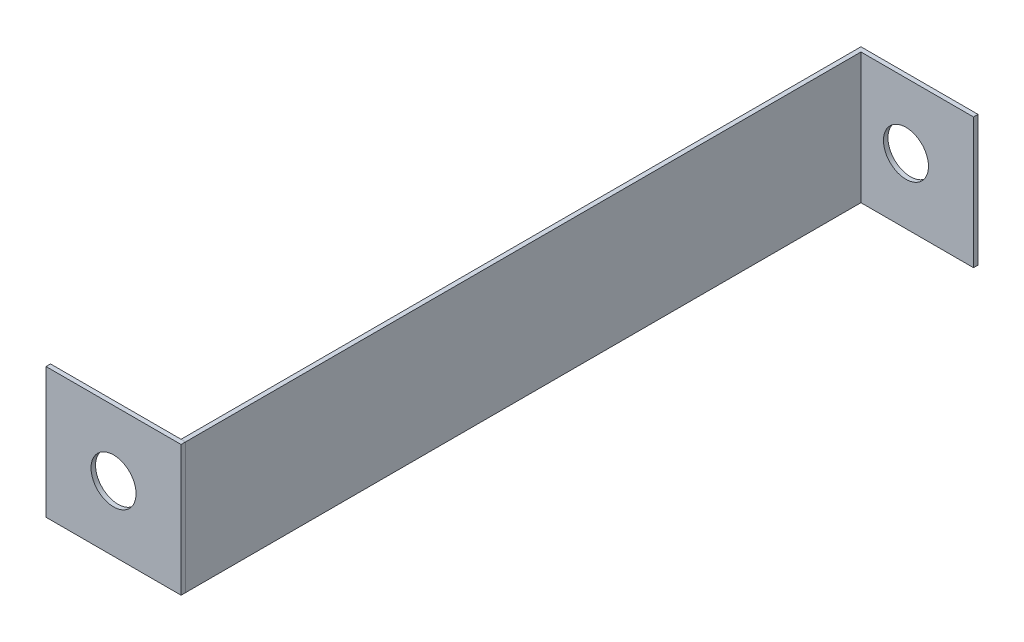
ISO-10303-21;
HEADER;
FILE_DESCRIPTION(('STEP AP214'),'2;1');
FILE_NAME('part.step','',(''),(''),'','','');
FILE_SCHEMA(('AUTOMOTIVE_DESIGN { 1 0 10303 214 1 1 1 1 }'));
ENDSEC;
DATA;
#1=APPLICATION_CONTEXT('core data for automotive mechanical design processes');
#2=APPLICATION_PROTOCOL_DEFINITION('international standard','automotive_design',2000,#1);
#3=PRODUCT_CONTEXT('',#1,'mechanical');
#4=PRODUCT('Part','Part','',(#3));
#5=PRODUCT_RELATED_PRODUCT_CATEGORY('part','',(#4));
#6=PRODUCT_DEFINITION_FORMATION('','',#4);
#7=PRODUCT_DEFINITION_CONTEXT('part definition',#1,'design');
#8=PRODUCT_DEFINITION('design','',#6,#7);
#9=PRODUCT_DEFINITION_SHAPE('','',#8);
#10=(LENGTH_UNIT() NAMED_UNIT(*) SI_UNIT(.MILLI.,.METRE.));
#11=(NAMED_UNIT(*) PLANE_ANGLE_UNIT() SI_UNIT($,.RADIAN.));
#12=(NAMED_UNIT(*) SI_UNIT($,.STERADIAN.) SOLID_ANGLE_UNIT());
#13=UNCERTAINTY_MEASURE_WITH_UNIT(LENGTH_MEASURE(1.E-05),#10,'distance_accuracy_value','');
#14=(GEOMETRIC_REPRESENTATION_CONTEXT(3) GLOBAL_UNCERTAINTY_ASSIGNED_CONTEXT((#13)) GLOBAL_UNIT_ASSIGNED_CONTEXT((#10,
#11,#12)) REPRESENTATION_CONTEXT('',''));
#15=CARTESIAN_POINT('',(0.,0.,0.));
#16=DIRECTION('',(0.,0.,1.));
#17=DIRECTION('',(1.,0.,0.));
#18=AXIS2_PLACEMENT_3D('',#15,#16,#17);
#19=CARTESIAN_POINT('',(0.,29.,152.));
#20=DIRECTION('',(0.,-1.,0.));
#21=DIRECTION('',(0.,0.,-1.));
#22=AXIS2_PLACEMENT_3D('',#19,#20,#21);
#23=PLANE('',#22);
#24=DIRECTION('',(-1.,0.,0.));
#25=VECTOR('',#24,1.);
#26=CARTESIAN_POINT('',(0.,29.,151.));
#27=LINE('',#26,#25);
#28=CARTESIAN_POINT('',(-25.,29.,151.));
#29=VERTEX_POINT('',#28);
#30=CARTESIAN_POINT('',(-55.,29.,151.));
#31=VERTEX_POINT('',#30);
#32=EDGE_CURVE('E108',#29,#31,#27,.T.);
#33=ORIENTED_EDGE('',*,*,#32,.T.);
#34=DIRECTION('',(0.,0.,-1.));
#35=VECTOR('',#34,1.);
#36=CARTESIAN_POINT('',(-55.,29.,152.));
#37=LINE('',#36,#35);
#38=CARTESIAN_POINT('',(-55.,29.,152.));
#39=VERTEX_POINT('',#38);
#40=EDGE_CURVE('E12',#39,#31,#37,.T.);
#41=ORIENTED_EDGE('',*,*,#40,.F.);
#42=DIRECTION('',(-1.,0.,0.));
#43=VECTOR('',#42,1.);
#44=CARTESIAN_POINT('',(0.,29.,152.));
#45=LINE('',#44,#43);
#46=CARTESIAN_POINT('',(-25.,29.,152.));
#47=VERTEX_POINT('',#46);
#48=EDGE_CURVE('E90',#47,#39,#45,.T.);
#49=ORIENTED_EDGE('',*,*,#48,.F.);
#50=DIRECTION('',(0.,0.,-1.));
#51=VECTOR('',#50,1.);
#52=CARTESIAN_POINT('',(-25.,29.,152.));
#53=LINE('',#52,#51);
#54=EDGE_CURVE('E101',#47,#29,#53,.T.);
#55=ORIENTED_EDGE('',*,*,#54,.T.);
#56=EDGE_LOOP('',(#33,#41,#49,#55));
#57=FACE_BOUND('',#56,.T.);
#58=ADVANCED_FACE('F42',(#57),#23,.F.);
#59=CARTESIAN_POINT('',(-55.,0.,152.));
#60=DIRECTION('',(1.,0.,0.));
#61=DIRECTION('',(0.,0.,-1.));
#62=AXIS2_PLACEMENT_3D('',#59,#60,#61);
#63=PLANE('',#62);
#64=DIRECTION('',(0.,-1.,0.));
#65=VECTOR('',#64,1.);
#66=CARTESIAN_POINT('',(-55.,0.,151.));
#67=LINE('',#66,#65);
#68=CARTESIAN_POINT('',(-55.,0.,151.));
#69=VERTEX_POINT('',#68);
#70=EDGE_CURVE('E95',#31,#69,#67,.T.);
#71=ORIENTED_EDGE('',*,*,#70,.T.);
#72=DIRECTION('',(0.,0.,-1.));
#73=VECTOR('',#72,1.);
#74=CARTESIAN_POINT('',(-55.,0.,152.));
#75=LINE('',#74,#73);
#76=CARTESIAN_POINT('',(-55.,0.,152.));
#77=VERTEX_POINT('',#76);
#78=EDGE_CURVE('E51',#77,#69,#75,.T.);
#79=ORIENTED_EDGE('',*,*,#78,.F.);
#80=DIRECTION('',(0.,-1.,0.));
#81=VECTOR('',#80,1.);
#82=CARTESIAN_POINT('',(-55.,0.,152.));
#83=LINE('',#82,#81);
#84=EDGE_CURVE('E85',#39,#77,#83,.T.);
#85=ORIENTED_EDGE('',*,*,#84,.F.);
#86=ORIENTED_EDGE('',*,*,#40,.T.);
#87=EDGE_LOOP('',(#71,#79,#85,#86));
#88=FACE_BOUND('',#87,.T.);
#89=ADVANCED_FACE('F94',(#88),#63,.F.);
#90=CARTESIAN_POINT('',(0.,0.,152.));
#91=DIRECTION('',(0.,-1.,0.));
#92=DIRECTION('',(1.,0.,0.));
#93=AXIS2_PLACEMENT_3D('',#90,#91,#92);
#94=PLANE('',#93);
#95=DIRECTION('',(-1.,0.,0.));
#96=VECTOR('',#95,1.);
#97=CARTESIAN_POINT('',(0.,0.,151.));
#98=LINE('',#97,#96);
#99=CARTESIAN_POINT('',(-25.,0.,151.));
#100=VERTEX_POINT('',#99);
#101=EDGE_CURVE('E112',#100,#69,#98,.T.);
#102=ORIENTED_EDGE('',*,*,#101,.F.);
#103=DIRECTION('',(0.,0.,-1.));
#104=VECTOR('',#103,1.);
#105=CARTESIAN_POINT('',(-25.,0.,152.));
#106=LINE('',#105,#104);
#107=CARTESIAN_POINT('',(-25.,0.,152.));
#108=VERTEX_POINT('',#107);
#109=EDGE_CURVE('E75',#108,#100,#106,.T.);
#110=ORIENTED_EDGE('',*,*,#109,.F.);
#111=DIRECTION('',(-1.,0.,0.));
#112=VECTOR('',#111,1.);
#113=CARTESIAN_POINT('',(0.,0.,152.));
#114=LINE('',#113,#112);
#115=EDGE_CURVE('E88',#108,#77,#114,.T.);
#116=ORIENTED_EDGE('',*,*,#115,.T.);
#117=ORIENTED_EDGE('',*,*,#78,.T.);
#118=EDGE_LOOP('',(#102,#110,#116,#117));
#119=FACE_BOUND('',#118,.T.);
#120=ADVANCED_FACE('F99',(#119),#94,.T.);
#121=CARTESIAN_POINT('',(-40.,14.5,152.));
#122=DIRECTION('',(0.,0.,-1.));
#123=DIRECTION('',(-1.,0.,0.));
#124=AXIS2_PLACEMENT_3D('',#121,#122,#123);
#125=CYLINDRICAL_SURFACE('',#124,5.);
#126=CARTESIAN_POINT('',(-40.,14.5,152.));
#127=DIRECTION('',(0.,0.,1.));
#128=DIRECTION('',(1.,0.,0.));
#129=AXIS2_PLACEMENT_3D('',#126,#127,#128);
#130=CIRCLE('',#129,5.);
#131=CARTESIAN_POINT('',(-35.,14.5,152.));
#132=VERTEX_POINT('',#131);
#133=EDGE_CURVE('E115',#132,#132,#130,.T.);
#134=ORIENTED_EDGE('',*,*,#133,.T.);
#135=EDGE_LOOP('',(#134));
#136=FACE_BOUND('',#135,.T.);
#137=CARTESIAN_POINT('',(-40.,14.5,151.));
#138=DIRECTION('',(0.,0.,1.));
#139=DIRECTION('',(1.,0.,0.));
#140=AXIS2_PLACEMENT_3D('',#137,#138,#139);
#141=CIRCLE('',#140,5.);
#142=CARTESIAN_POINT('',(-35.,14.5,151.));
#143=VERTEX_POINT('',#142);
#144=EDGE_CURVE('E105',#143,#143,#141,.T.);
#145=ORIENTED_EDGE('',*,*,#144,.F.);
#146=EDGE_LOOP('',(#145));
#147=FACE_BOUND('',#146,.T.);
#148=ADVANCED_FACE('F44',(#136,#147),#125,.F.);
#149=CARTESIAN_POINT('',(-25.,0.,152.));
#150=DIRECTION('',(-1.,0.,0.));
#151=DIRECTION('',(0.,0.,1.));
#152=AXIS2_PLACEMENT_3D('',#149,#150,#151);
#153=PLANE('',#152);
#154=DIRECTION('',(0.,1.,0.));
#155=VECTOR('',#154,1.);
#156=CARTESIAN_POINT('',(-25.,0.,151.));
#157=LINE('',#156,#155);
#158=EDGE_CURVE('E78',#100,#29,#157,.T.);
#159=ORIENTED_EDGE('',*,*,#158,.T.);
#160=ORIENTED_EDGE('',*,*,#54,.F.);
#161=DIRECTION('',(0.,1.,0.));
#162=VECTOR('',#161,1.);
#163=CARTESIAN_POINT('',(-25.,0.,152.));
#164=LINE('',#163,#162);
#165=EDGE_CURVE('E59',#108,#47,#164,.T.);
#166=ORIENTED_EDGE('',*,*,#165,.F.);
#167=ORIENTED_EDGE('',*,*,#109,.T.);
#168=EDGE_LOOP('',(#159,#160,#166,#167));
#169=FACE_BOUND('',#168,.T.);
#170=ADVANCED_FACE('F127',(#169),#153,.F.);
#171=CARTESIAN_POINT('',(0.,0.,152.));
#172=DIRECTION('',(0.,0.,1.));
#173=DIRECTION('',(1.,0.,0.));
#174=AXIS2_PLACEMENT_3D('',#171,#172,#173);
#175=PLANE('',#174);
#176=ORIENTED_EDGE('',*,*,#133,.F.);
#177=EDGE_LOOP('',(#176));
#178=FACE_BOUND('',#177,.T.);
#179=ORIENTED_EDGE('',*,*,#48,.T.);
#180=ORIENTED_EDGE('',*,*,#84,.T.);
#181=ORIENTED_EDGE('',*,*,#115,.F.);
#182=ORIENTED_EDGE('',*,*,#165,.T.);
#183=EDGE_LOOP('',(#179,#180,#181,#182));
#184=FACE_BOUND('',#183,.T.);
#185=ADVANCED_FACE('F86',(#178,#184),#175,.T.);
#186=CARTESIAN_POINT('',(0.,0.,151.));
#187=DIRECTION('',(0.,0.,1.));
#188=DIRECTION('',(1.,0.,0.));
#189=AXIS2_PLACEMENT_3D('',#186,#187,#188);
#190=PLANE('',#189);
#191=ORIENTED_EDGE('',*,*,#144,.T.);
#192=EDGE_LOOP('',(#191));
#193=FACE_BOUND('',#192,.T.);
#194=ORIENTED_EDGE('',*,*,#32,.F.);
#195=ORIENTED_EDGE('',*,*,#158,.F.);
#196=ORIENTED_EDGE('',*,*,#101,.T.);
#197=ORIENTED_EDGE('',*,*,#70,.F.);
#198=EDGE_LOOP('',(#194,#195,#196,#197));
#199=FACE_BOUND('',#198,.T.);
#200=ADVANCED_FACE('F120',(#193,#199),#190,.F.);
#201=CLOSED_SHELL('',(#58,#89,#120,#148,#170,#185,#200));
#202=MANIFOLD_SOLID_BREP('B2',#201);
#203=CARTESIAN_POINT('',(0.,0.,1.));
#204=DIRECTION('',(0.,0.,1.));
#205=DIRECTION('',(1.,0.,0.));
#206=AXIS2_PLACEMENT_3D('',#203,#204,#205);
#207=PLANE('',#206);
#208=DIRECTION('',(0.,1.,0.));
#209=VECTOR('',#208,1.);
#210=CARTESIAN_POINT('',(-25.,0.,1.));
#211=LINE('',#210,#209);
#212=CARTESIAN_POINT('',(-25.,0.,1.));
#213=VERTEX_POINT('',#212);
#214=CARTESIAN_POINT('',(-25.,29.,1.));
#215=VERTEX_POINT('',#214);
#216=EDGE_CURVE('E215',#213,#215,#211,.T.);
#217=ORIENTED_EDGE('',*,*,#216,.F.);
#218=DIRECTION('',(1.,0.,0.));
#219=VECTOR('',#218,1.);
#220=CARTESIAN_POINT('',(-26.,0.,1.));
#221=LINE('',#220,#219);
#222=CARTESIAN_POINT('',(0.,0.,1.));
#223=VERTEX_POINT('',#222);
#224=EDGE_CURVE('E253',#213,#223,#221,.T.);
#225=ORIENTED_EDGE('',*,*,#224,.T.);
#226=DIRECTION('',(0.,1.,0.));
#227=VECTOR('',#226,1.);
#228=CARTESIAN_POINT('',(0.,0.,1.));
#229=LINE('',#228,#227);
#230=CARTESIAN_POINT('',(0.,29.,1.));
#231=VERTEX_POINT('',#230);
#232=EDGE_CURVE('E221',#223,#231,#229,.T.);
#233=ORIENTED_EDGE('',*,*,#232,.T.);
#234=DIRECTION('',(-1.,0.,0.));
#235=VECTOR('',#234,1.);
#236=CARTESIAN_POINT('',(0.,29.,1.));
#237=LINE('',#236,#235);
#238=EDGE_CURVE('E264',#231,#215,#237,.T.);
#239=ORIENTED_EDGE('',*,*,#238,.T.);
#240=EDGE_LOOP('',(#217,#225,#233,#239));
#241=FACE_BOUND('',#240,.T.);
#242=CARTESIAN_POINT('',(-15.,14.5,1.));
#243=DIRECTION('',(0.,0.,1.));
#244=DIRECTION('',(1.,0.,0.));
#245=AXIS2_PLACEMENT_3D('',#242,#243,#244);
#246=CIRCLE('',#245,5.);
#247=CARTESIAN_POINT('',(-10.,14.5,1.));
#248=VERTEX_POINT('',#247);
#249=EDGE_CURVE('E269',#248,#248,#246,.T.);
#250=ORIENTED_EDGE('',*,*,#249,.F.);
#251=EDGE_LOOP('',(#250));
#252=FACE_BOUND('',#251,.T.);
#253=ADVANCED_FACE('F198',(#241,#252),#207,.T.);
#254=CARTESIAN_POINT('',(0.,0.,0.));
#255=DIRECTION('',(0.,0.,1.));
#256=DIRECTION('',(1.,0.,0.));
#257=AXIS2_PLACEMENT_3D('',#254,#255,#256);
#258=PLANE('',#257);
#259=DIRECTION('',(1.,0.,0.));
#260=VECTOR('',#259,1.);
#261=CARTESIAN_POINT('',(-26.,0.,0.));
#262=LINE('',#261,#260);
#263=CARTESIAN_POINT('',(-26.,0.,0.));
#264=VERTEX_POINT('',#263);
#265=CARTESIAN_POINT('',(0.,0.,0.));
#266=VERTEX_POINT('',#265);
#267=EDGE_CURVE('E259',#264,#266,#262,.T.);
#268=ORIENTED_EDGE('',*,*,#267,.F.);
#269=DIRECTION('',(0.,-1.,0.));
#270=VECTOR('',#269,1.);
#271=CARTESIAN_POINT('',(-26.,29.,0.));
#272=LINE('',#271,#270);
#273=CARTESIAN_POINT('',(-26.,29.,0.));
#274=VERTEX_POINT('',#273);
#275=EDGE_CURVE('E241',#274,#264,#272,.T.);
#276=ORIENTED_EDGE('',*,*,#275,.F.);
#277=DIRECTION('',(-1.,0.,0.));
#278=VECTOR('',#277,1.);
#279=CARTESIAN_POINT('',(0.,29.,0.));
#280=LINE('',#279,#278);
#281=CARTESIAN_POINT('',(0.,29.,0.));
#282=VERTEX_POINT('',#281);
#283=EDGE_CURVE('E254',#282,#274,#280,.T.);
#284=ORIENTED_EDGE('',*,*,#283,.F.);
#285=DIRECTION('',(0.,1.,0.));
#286=VECTOR('',#285,1.);
#287=CARTESIAN_POINT('',(0.,0.,0.));
#288=LINE('',#287,#286);
#289=EDGE_CURVE('E268',#266,#282,#288,.T.);
#290=ORIENTED_EDGE('',*,*,#289,.F.);
#291=EDGE_LOOP('',(#268,#276,#284,#290));
#292=FACE_BOUND('',#291,.T.);
#293=CARTESIAN_POINT('',(-15.,14.5,0.));
#294=DIRECTION('',(0.,0.,1.));
#295=DIRECTION('',(1.,0.,0.));
#296=AXIS2_PLACEMENT_3D('',#293,#294,#295);
#297=CIRCLE('',#296,5.);
#298=CARTESIAN_POINT('',(-10.,14.5,0.));
#299=VERTEX_POINT('',#298);
#300=EDGE_CURVE('E273',#299,#299,#297,.T.);
#301=ORIENTED_EDGE('',*,*,#300,.T.);
#302=EDGE_LOOP('',(#301));
#303=FACE_BOUND('',#302,.T.);
#304=ADVANCED_FACE('F266',(#292,#303),#258,.F.);
#305=CARTESIAN_POINT('',(-26.,0.,1.));
#306=DIRECTION('',(0.,1.,0.));
#307=DIRECTION('',(0.,0.,1.));
#308=AXIS2_PLACEMENT_3D('',#305,#306,#307);
#309=PLANE('',#308);
#310=ORIENTED_EDGE('',*,*,#267,.T.);
#311=DIRECTION('',(0.,0.,-1.));
#312=VECTOR('',#311,1.);
#313=CARTESIAN_POINT('',(0.,0.,1.));
#314=LINE('',#313,#312);
#315=EDGE_CURVE('E40',#223,#266,#314,.T.);
#316=ORIENTED_EDGE('',*,*,#315,.F.);
#317=ORIENTED_EDGE('',*,*,#224,.F.);
#318=DIRECTION('',(0.,0.,-1.));
#319=VECTOR('',#318,1.);
#320=CARTESIAN_POINT('',(-25.,0.,151.));
#321=LINE('',#320,#319);
#322=CARTESIAN_POINT('',(-25.,0.,151.));
#323=VERTEX_POINT('',#322);
#324=EDGE_CURVE('E301',#323,#213,#321,.T.);
#325=ORIENTED_EDGE('',*,*,#324,.F.);
#326=DIRECTION('',(1.,0.,0.));
#327=VECTOR('',#326,1.);
#328=CARTESIAN_POINT('',(-26.,0.,151.));
#329=LINE('',#328,#327);
#330=CARTESIAN_POINT('',(-26.,0.,151.));
#331=VERTEX_POINT('',#330);
#332=EDGE_CURVE('E262',#331,#323,#329,.T.);
#333=ORIENTED_EDGE('',*,*,#332,.F.);
#334=DIRECTION('',(0.,0.,-1.));
#335=VECTOR('',#334,1.);
#336=CARTESIAN_POINT('',(-26.,0.,1.));
#337=LINE('',#336,#335);
#338=EDGE_CURVE('E246',#331,#264,#337,.T.);
#339=ORIENTED_EDGE('',*,*,#338,.T.);
#340=EDGE_LOOP('',(#310,#316,#317,#325,#333,#339));
#341=FACE_BOUND('',#340,.T.);
#342=ADVANCED_FACE('F200',(#341),#309,.F.);
#343=CARTESIAN_POINT('',(0.,0.,1.));
#344=DIRECTION('',(-1.,0.,0.));
#345=DIRECTION('',(0.,0.,1.));
#346=AXIS2_PLACEMENT_3D('',#343,#344,#345);
#347=PLANE('',#346);
#348=ORIENTED_EDGE('',*,*,#289,.T.);
#349=DIRECTION('',(0.,0.,-1.));
#350=VECTOR('',#349,1.);
#351=CARTESIAN_POINT('',(0.,29.,1.));
#352=LINE('',#351,#350);
#353=EDGE_CURVE('E207',#231,#282,#352,.T.);
#354=ORIENTED_EDGE('',*,*,#353,.F.);
#355=ORIENTED_EDGE('',*,*,#232,.F.);
#356=ORIENTED_EDGE('',*,*,#315,.T.);
#357=EDGE_LOOP('',(#348,#354,#355,#356));
#358=FACE_BOUND('',#357,.T.);
#359=ADVANCED_FACE('F325',(#358),#347,.F.);
#360=CARTESIAN_POINT('',(0.,29.,1.));
#361=DIRECTION('',(0.,-1.,0.));
#362=DIRECTION('',(0.,0.,-1.));
#363=AXIS2_PLACEMENT_3D('',#360,#361,#362);
#364=PLANE('',#363);
#365=ORIENTED_EDGE('',*,*,#283,.T.);
#366=DIRECTION('',(0.,0.,-1.));
#367=VECTOR('',#366,1.);
#368=CARTESIAN_POINT('',(-26.,29.,1.));
#369=LINE('',#368,#367);
#370=CARTESIAN_POINT('',(-26.,29.,151.));
#371=VERTEX_POINT('',#370);
#372=EDGE_CURVE('E249',#371,#274,#369,.T.);
#373=ORIENTED_EDGE('',*,*,#372,.F.);
#374=DIRECTION('',(-1.,0.,0.));
#375=VECTOR('',#374,1.);
#376=CARTESIAN_POINT('',(-25.,29.,151.));
#377=LINE('',#376,#375);
#378=CARTESIAN_POINT('',(-25.,29.,151.));
#379=VERTEX_POINT('',#378);
#380=EDGE_CURVE('E305',#379,#371,#377,.T.);
#381=ORIENTED_EDGE('',*,*,#380,.F.);
#382=DIRECTION('',(0.,0.,-1.));
#383=VECTOR('',#382,1.);
#384=CARTESIAN_POINT('',(-25.,29.,151.));
#385=LINE('',#384,#383);
#386=EDGE_CURVE('E299',#379,#215,#385,.T.);
#387=ORIENTED_EDGE('',*,*,#386,.T.);
#388=ORIENTED_EDGE('',*,*,#238,.F.);
#389=ORIENTED_EDGE('',*,*,#353,.T.);
#390=EDGE_LOOP('',(#365,#373,#381,#387,#388,#389));
#391=FACE_BOUND('',#390,.T.);
#392=ADVANCED_FACE('F303',(#391),#364,.F.);
#393=CARTESIAN_POINT('',(-26.,29.,1.));
#394=DIRECTION('',(1.,0.,0.));
#395=DIRECTION('',(0.,1.,0.));
#396=AXIS2_PLACEMENT_3D('',#393,#394,#395);
#397=PLANE('',#396);
#398=ORIENTED_EDGE('',*,*,#275,.T.);
#399=ORIENTED_EDGE('',*,*,#338,.F.);
#400=DIRECTION('',(0.,-1.,0.));
#401=VECTOR('',#400,1.);
#402=CARTESIAN_POINT('',(-26.,29.,151.));
#403=LINE('',#402,#401);
#404=EDGE_CURVE('E302',#371,#331,#403,.T.);
#405=ORIENTED_EDGE('',*,*,#404,.F.);
#406=ORIENTED_EDGE('',*,*,#372,.T.);
#407=EDGE_LOOP('',(#398,#399,#405,#406));
#408=FACE_BOUND('',#407,.T.);
#409=ADVANCED_FACE('F243',(#408),#397,.F.);
#410=CARTESIAN_POINT('',(-15.,14.5,1.));
#411=DIRECTION('',(0.,0.,-1.));
#412=DIRECTION('',(-1.,0.,0.));
#413=AXIS2_PLACEMENT_3D('',#410,#411,#412);
#414=CYLINDRICAL_SURFACE('',#413,5.);
#415=ORIENTED_EDGE('',*,*,#249,.T.);
#416=EDGE_LOOP('',(#415));
#417=FACE_BOUND('',#416,.T.);
#418=ORIENTED_EDGE('',*,*,#300,.F.);
#419=EDGE_LOOP('',(#418));
#420=FACE_BOUND('',#419,.T.);
#421=ADVANCED_FACE('F339',(#417,#420),#414,.F.);
#422=CARTESIAN_POINT('',(-25.,0.,151.));
#423=DIRECTION('',(-1.,0.,0.));
#424=DIRECTION('',(0.,0.,1.));
#425=AXIS2_PLACEMENT_3D('',#422,#423,#424);
#426=PLANE('',#425);
#427=ORIENTED_EDGE('',*,*,#216,.T.);
#428=ORIENTED_EDGE('',*,*,#386,.F.);
#429=DIRECTION('',(0.,1.,0.));
#430=VECTOR('',#429,1.);
#431=CARTESIAN_POINT('',(-25.,0.,151.));
#432=LINE('',#431,#430);
#433=EDGE_CURVE('E307',#323,#379,#432,.T.);
#434=ORIENTED_EDGE('',*,*,#433,.F.);
#435=ORIENTED_EDGE('',*,*,#324,.T.);
#436=EDGE_LOOP('',(#427,#428,#434,#435));
#437=FACE_BOUND('',#436,.T.);
#438=ADVANCED_FACE('F296',(#437),#426,.F.);
#439=CARTESIAN_POINT('',(0.,0.,151.));
#440=DIRECTION('',(0.,0.,1.));
#441=DIRECTION('',(1.,0.,0.));
#442=AXIS2_PLACEMENT_3D('',#439,#440,#441);
#443=PLANE('',#442);
#444=ORIENTED_EDGE('',*,*,#404,.T.);
#445=ORIENTED_EDGE('',*,*,#332,.T.);
#446=ORIENTED_EDGE('',*,*,#433,.T.);
#447=ORIENTED_EDGE('',*,*,#380,.T.);
#448=EDGE_LOOP('',(#444,#445,#446,#447));
#449=FACE_BOUND('',#448,.T.);
#450=ADVANCED_FACE('F318',(#449),#443,.T.);
#451=CLOSED_SHELL('',(#253,#304,#342,#359,#392,#409,#421,#438,#450));
#452=MANIFOLD_SOLID_BREP('B6',#451);
#453=ADVANCED_BREP_SHAPE_REPRESENTATION('',(#18,#202,#452),#14);
#454=SHAPE_DEFINITION_REPRESENTATION(#9,#453);
ENDSEC;
END-ISO-10303-21;
